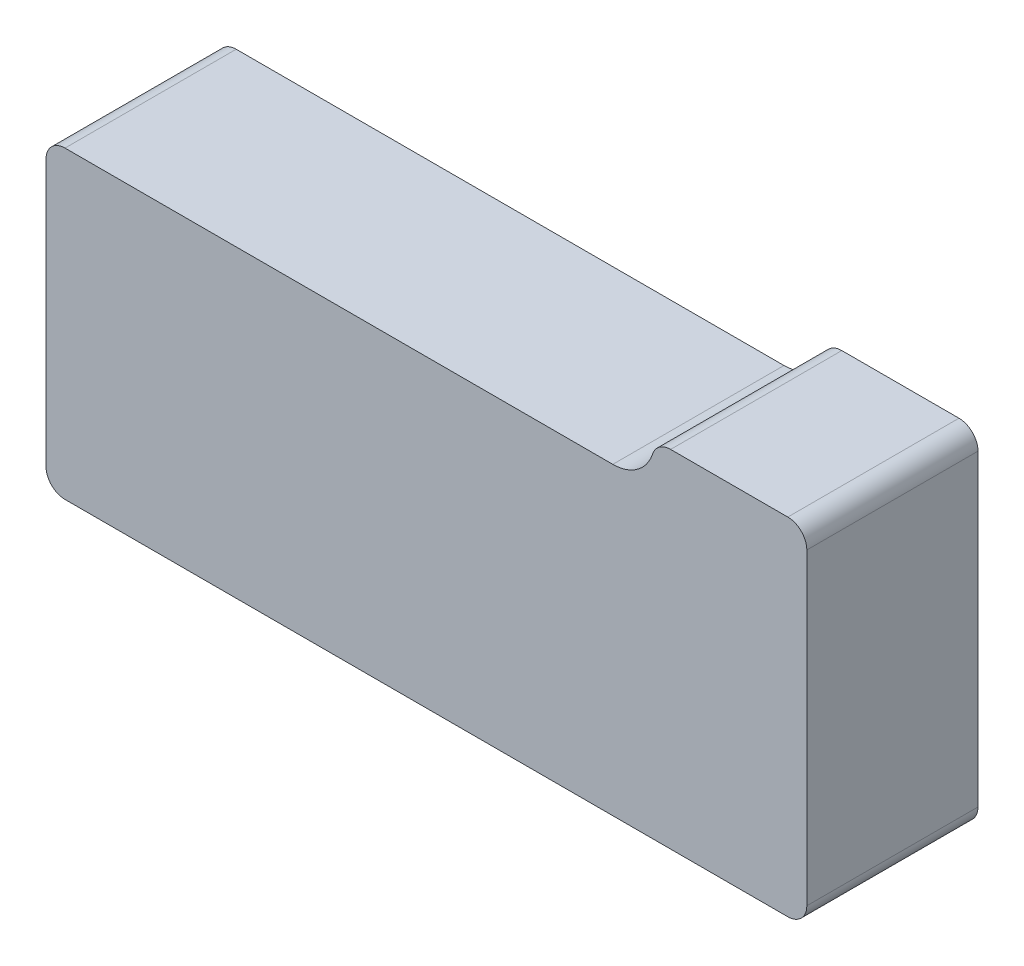
ISO-10303-21;
HEADER;
FILE_DESCRIPTION(('STEP AP214'),'2;1');
FILE_NAME('part.step','',(''),(''),'','','');
FILE_SCHEMA(('AUTOMOTIVE_DESIGN { 1 0 10303 214 1 1 1 1 }'));
ENDSEC;
DATA;
#1=APPLICATION_CONTEXT('core data for automotive mechanical design processes');
#2=APPLICATION_PROTOCOL_DEFINITION('international standard','automotive_design',2000,#1);
#3=PRODUCT_CONTEXT('',#1,'mechanical');
#4=PRODUCT('Part','Part','',(#3));
#5=PRODUCT_RELATED_PRODUCT_CATEGORY('part','',(#4));
#6=PRODUCT_DEFINITION_FORMATION('','',#4);
#7=PRODUCT_DEFINITION_CONTEXT('part definition',#1,'design');
#8=PRODUCT_DEFINITION('design','',#6,#7);
#9=PRODUCT_DEFINITION_SHAPE('','',#8);
#10=(LENGTH_UNIT() NAMED_UNIT(*) SI_UNIT(.MILLI.,.METRE.));
#11=(NAMED_UNIT(*) PLANE_ANGLE_UNIT() SI_UNIT($,.RADIAN.));
#12=(NAMED_UNIT(*) SI_UNIT($,.STERADIAN.) SOLID_ANGLE_UNIT());
#13=UNCERTAINTY_MEASURE_WITH_UNIT(LENGTH_MEASURE(1.E-05),#10,'distance_accuracy_value','');
#14=(GEOMETRIC_REPRESENTATION_CONTEXT(3) GLOBAL_UNCERTAINTY_ASSIGNED_CONTEXT((#13)) GLOBAL_UNIT_ASSIGNED_CONTEXT((#10,
#11,#12)) REPRESENTATION_CONTEXT('',''));
#15=CARTESIAN_POINT('',(0.,0.,0.));
#16=DIRECTION('',(0.,0.,1.));
#17=DIRECTION('',(1.,0.,0.));
#18=AXIS2_PLACEMENT_3D('',#15,#16,#17);
#19=CARTESIAN_POINT('',(49.,51.,45.));
#20=DIRECTION('',(0.,0.,-1.));
#21=DIRECTION('',(-1.,0.,0.));
#22=AXIS2_PLACEMENT_3D('',#19,#20,#21);
#23=CYLINDRICAL_SURFACE('',#22,11.);
#24=CARTESIAN_POINT('',(49.,51.,0.));
#25=DIRECTION('',(0.,0.,-1.));
#26=DIRECTION('',(1.,0.,0.));
#27=AXIS2_PLACEMENT_3D('',#24,#25,#26);
#28=CIRCLE('',#27,11.);
#29=CARTESIAN_POINT('',(59.4490953555798,47.5625,0.));
#30=VERTEX_POINT('',#29);
#31=CARTESIAN_POINT('',(49.,40.,0.));
#32=VERTEX_POINT('',#31);
#33=EDGE_CURVE('E152',#30,#32,#28,.T.);
#34=ORIENTED_EDGE('',*,*,#33,.T.);
#35=DIRECTION('',(0.,0.,-1.));
#36=VECTOR('',#35,1.);
#37=CARTESIAN_POINT('',(49.,40.,45.));
#38=LINE('',#37,#36);
#39=CARTESIAN_POINT('',(49.,40.,45.));
#40=VERTEX_POINT('',#39);
#41=EDGE_CURVE('E11',#40,#32,#38,.T.);
#42=ORIENTED_EDGE('',*,*,#41,.F.);
#43=CARTESIAN_POINT('',(49.,51.,45.));
#44=DIRECTION('',(0.,0.,-1.));
#45=DIRECTION('',(1.,0.,0.));
#46=AXIS2_PLACEMENT_3D('',#43,#44,#45);
#47=CIRCLE('',#46,11.);
#48=CARTESIAN_POINT('',(59.4490953555798,47.5625,45.));
#49=VERTEX_POINT('',#48);
#50=EDGE_CURVE('E176',#49,#40,#47,.T.);
#51=ORIENTED_EDGE('',*,*,#50,.F.);
#52=DIRECTION('',(0.,0.,-1.));
#53=VECTOR('',#52,1.);
#54=CARTESIAN_POINT('',(59.4490953555798,47.5625,45.));
#55=LINE('',#54,#53);
#56=EDGE_CURVE('E148',#49,#30,#55,.T.);
#57=ORIENTED_EDGE('',*,*,#56,.T.);
#58=EDGE_LOOP('',(#34,#42,#51,#57));
#59=FACE_BOUND('',#58,.T.);
#60=ADVANCED_FACE('F38',(#59),#23,.F.);
#61=CARTESIAN_POINT('',(-95.,40.,45.));
#62=DIRECTION('',(0.,-1.,0.));
#63=DIRECTION('',(1.,0.,0.));
#64=AXIS2_PLACEMENT_3D('',#61,#62,#63);
#65=PLANE('',#64);
#66=DIRECTION('',(-1.,0.,0.));
#67=VECTOR('',#66,1.);
#68=CARTESIAN_POINT('',(-95.,40.,0.));
#69=LINE('',#68,#67);
#70=CARTESIAN_POINT('',(-95.,40.,0.));
#71=VERTEX_POINT('',#70);
#72=EDGE_CURVE('E155',#32,#71,#69,.T.);
#73=ORIENTED_EDGE('',*,*,#72,.T.);
#74=DIRECTION('',(0.,0.,-1.));
#75=VECTOR('',#74,1.);
#76=CARTESIAN_POINT('',(-95.,40.,45.));
#77=LINE('',#76,#75);
#78=CARTESIAN_POINT('',(-95.,40.,45.));
#79=VERTEX_POINT('',#78);
#80=EDGE_CURVE('E46',#79,#71,#77,.T.);
#81=ORIENTED_EDGE('',*,*,#80,.F.);
#82=DIRECTION('',(-1.,0.,0.));
#83=VECTOR('',#82,1.);
#84=CARTESIAN_POINT('',(-95.,40.,45.));
#85=LINE('',#84,#83);
#86=EDGE_CURVE('E106',#40,#79,#85,.T.);
#87=ORIENTED_EDGE('',*,*,#86,.F.);
#88=ORIENTED_EDGE('',*,*,#41,.T.);
#89=EDGE_LOOP('',(#73,#81,#87,#88));
#90=FACE_BOUND('',#89,.T.);
#91=ADVANCED_FACE('F248',(#90),#65,.F.);
#92=CARTESIAN_POINT('',(-95.,35.,45.));
#93=DIRECTION('',(0.,0.,-1.));
#94=DIRECTION('',(-1.,0.,0.));
#95=AXIS2_PLACEMENT_3D('',#92,#93,#94);
#96=CYLINDRICAL_SURFACE('',#95,5.);
#97=CARTESIAN_POINT('',(-95.,35.,0.));
#98=DIRECTION('',(0.,0.,1.));
#99=DIRECTION('',(1.,0.,0.));
#100=AXIS2_PLACEMENT_3D('',#97,#98,#99);
#101=CIRCLE('',#100,5.);
#102=CARTESIAN_POINT('',(-100.,35.,0.));
#103=VERTEX_POINT('',#102);
#104=EDGE_CURVE('E158',#71,#103,#101,.T.);
#105=ORIENTED_EDGE('',*,*,#104,.T.);
#106=DIRECTION('',(0.,0.,-1.));
#107=VECTOR('',#106,1.);
#108=CARTESIAN_POINT('',(-100.,35.,45.));
#109=LINE('',#108,#107);
#110=CARTESIAN_POINT('',(-100.,35.,45.));
#111=VERTEX_POINT('',#110);
#112=EDGE_CURVE('E192',#111,#103,#109,.T.);
#113=ORIENTED_EDGE('',*,*,#112,.F.);
#114=CARTESIAN_POINT('',(-95.,35.,45.));
#115=DIRECTION('',(0.,0.,1.));
#116=DIRECTION('',(1.,0.,0.));
#117=AXIS2_PLACEMENT_3D('',#114,#115,#116);
#118=CIRCLE('',#117,5.);
#119=EDGE_CURVE('E200',#79,#111,#118,.T.);
#120=ORIENTED_EDGE('',*,*,#119,.F.);
#121=ORIENTED_EDGE('',*,*,#80,.T.);
#122=EDGE_LOOP('',(#105,#113,#120,#121));
#123=FACE_BOUND('',#122,.T.);
#124=ADVANCED_FACE('F198',(#123),#96,.T.);
#125=CARTESIAN_POINT('',(-100.,35.,45.));
#126=DIRECTION('',(1.,0.,0.));
#127=DIRECTION('',(0.,1.,0.));
#128=AXIS2_PLACEMENT_3D('',#125,#126,#127);
#129=PLANE('',#128);
#130=DIRECTION('',(0.,-1.,0.));
#131=VECTOR('',#130,1.);
#132=CARTESIAN_POINT('',(-100.,35.,0.));
#133=LINE('',#132,#131);
#134=CARTESIAN_POINT('',(-100.,-35.,0.));
#135=VERTEX_POINT('',#134);
#136=EDGE_CURVE('E160',#103,#135,#133,.T.);
#137=ORIENTED_EDGE('',*,*,#136,.T.);
#138=DIRECTION('',(0.,0.,-1.));
#139=VECTOR('',#138,1.);
#140=CARTESIAN_POINT('',(-100.,-35.,45.));
#141=LINE('',#140,#139);
#142=CARTESIAN_POINT('',(-100.,-35.,45.));
#143=VERTEX_POINT('',#142);
#144=EDGE_CURVE('E189',#143,#135,#141,.T.);
#145=ORIENTED_EDGE('',*,*,#144,.F.);
#146=DIRECTION('',(0.,-1.,0.));
#147=VECTOR('',#146,1.);
#148=CARTESIAN_POINT('',(-100.,35.,45.));
#149=LINE('',#148,#147);
#150=EDGE_CURVE('E218',#111,#143,#149,.T.);
#151=ORIENTED_EDGE('',*,*,#150,.F.);
#152=ORIENTED_EDGE('',*,*,#112,.T.);
#153=EDGE_LOOP('',(#137,#145,#151,#152));
#154=FACE_BOUND('',#153,.T.);
#155=ADVANCED_FACE('F209',(#154),#129,.F.);
#156=CARTESIAN_POINT('',(-95.,-35.,45.));
#157=DIRECTION('',(0.,0.,-1.));
#158=DIRECTION('',(-1.,0.,0.));
#159=AXIS2_PLACEMENT_3D('',#156,#157,#158);
#160=CYLINDRICAL_SURFACE('',#159,5.);
#161=CARTESIAN_POINT('',(-95.,-35.,0.));
#162=DIRECTION('',(0.,0.,1.));
#163=DIRECTION('',(1.,0.,0.));
#164=AXIS2_PLACEMENT_3D('',#161,#162,#163);
#165=CIRCLE('',#164,5.);
#166=CARTESIAN_POINT('',(-95.,-40.,0.));
#167=VERTEX_POINT('',#166);
#168=EDGE_CURVE('E163',#135,#167,#165,.T.);
#169=ORIENTED_EDGE('',*,*,#168,.T.);
#170=DIRECTION('',(0.,0.,-1.));
#171=VECTOR('',#170,1.);
#172=CARTESIAN_POINT('',(-95.,-40.,45.));
#173=LINE('',#172,#171);
#174=CARTESIAN_POINT('',(-95.,-40.,45.));
#175=VERTEX_POINT('',#174);
#176=EDGE_CURVE('E186',#175,#167,#173,.T.);
#177=ORIENTED_EDGE('',*,*,#176,.F.);
#178=CARTESIAN_POINT('',(-95.,-35.,45.));
#179=DIRECTION('',(0.,0.,1.));
#180=DIRECTION('',(1.,0.,0.));
#181=AXIS2_PLACEMENT_3D('',#178,#179,#180);
#182=CIRCLE('',#181,5.);
#183=EDGE_CURVE('E215',#143,#175,#182,.T.);
#184=ORIENTED_EDGE('',*,*,#183,.F.);
#185=ORIENTED_EDGE('',*,*,#144,.T.);
#186=EDGE_LOOP('',(#169,#177,#184,#185));
#187=FACE_BOUND('',#186,.T.);
#188=ADVANCED_FACE('F213',(#187),#160,.T.);
#189=CARTESIAN_POINT('',(-95.,-40.,45.));
#190=DIRECTION('',(0.,1.,0.));
#191=DIRECTION('',(0.,0.,1.));
#192=AXIS2_PLACEMENT_3D('',#189,#190,#191);
#193=PLANE('',#192);
#194=DIRECTION('',(1.,0.,0.));
#195=VECTOR('',#194,1.);
#196=CARTESIAN_POINT('',(-95.,-40.,0.));
#197=LINE('',#196,#195);
#198=CARTESIAN_POINT('',(95.,-40.,0.));
#199=VERTEX_POINT('',#198);
#200=EDGE_CURVE('E165',#167,#199,#197,.T.);
#201=ORIENTED_EDGE('',*,*,#200,.T.);
#202=DIRECTION('',(0.,0.,-1.));
#203=VECTOR('',#202,1.);
#204=CARTESIAN_POINT('',(95.,-40.,45.));
#205=LINE('',#204,#203);
#206=CARTESIAN_POINT('',(95.,-40.,45.));
#207=VERTEX_POINT('',#206);
#208=EDGE_CURVE('E183',#207,#199,#205,.T.);
#209=ORIENTED_EDGE('',*,*,#208,.F.);
#210=DIRECTION('',(1.,0.,0.));
#211=VECTOR('',#210,1.);
#212=CARTESIAN_POINT('',(-95.,-40.,45.));
#213=LINE('',#212,#211);
#214=EDGE_CURVE('E217',#175,#207,#213,.T.);
#215=ORIENTED_EDGE('',*,*,#214,.F.);
#216=ORIENTED_EDGE('',*,*,#176,.T.);
#217=EDGE_LOOP('',(#201,#209,#215,#216));
#218=FACE_BOUND('',#217,.T.);
#219=ADVANCED_FACE('F261',(#218),#193,.F.);
#220=CARTESIAN_POINT('',(95.,-35.,45.));
#221=DIRECTION('',(0.,0.,-1.));
#222=DIRECTION('',(-1.,0.,0.));
#223=AXIS2_PLACEMENT_3D('',#220,#221,#222);
#224=CYLINDRICAL_SURFACE('',#223,5.);
#225=CARTESIAN_POINT('',(95.,-35.,0.));
#226=DIRECTION('',(0.,0.,1.));
#227=DIRECTION('',(1.,0.,0.));
#228=AXIS2_PLACEMENT_3D('',#225,#226,#227);
#229=CIRCLE('',#228,5.);
#230=CARTESIAN_POINT('',(100.,-35.,0.));
#231=VERTEX_POINT('',#230);
#232=EDGE_CURVE('E168',#199,#231,#229,.T.);
#233=ORIENTED_EDGE('',*,*,#232,.T.);
#234=DIRECTION('',(0.,0.,-1.));
#235=VECTOR('',#234,1.);
#236=CARTESIAN_POINT('',(100.,-35.,45.));
#237=LINE('',#236,#235);
#238=CARTESIAN_POINT('',(100.,-35.,45.));
#239=VERTEX_POINT('',#238);
#240=EDGE_CURVE('E180',#239,#231,#237,.T.);
#241=ORIENTED_EDGE('',*,*,#240,.F.);
#242=CARTESIAN_POINT('',(95.,-35.,45.));
#243=DIRECTION('',(0.,0.,1.));
#244=DIRECTION('',(1.,0.,0.));
#245=AXIS2_PLACEMENT_3D('',#242,#243,#244);
#246=CIRCLE('',#245,5.);
#247=EDGE_CURVE('E220',#207,#239,#246,.T.);
#248=ORIENTED_EDGE('',*,*,#247,.F.);
#249=ORIENTED_EDGE('',*,*,#208,.T.);
#250=EDGE_LOOP('',(#233,#241,#248,#249));
#251=FACE_BOUND('',#250,.T.);
#252=ADVANCED_FACE('F229',(#251),#224,.T.);
#253=CARTESIAN_POINT('',(100.,46.,45.));
#254=DIRECTION('',(-1.,0.,0.));
#255=DIRECTION('',(0.,-1.,0.));
#256=AXIS2_PLACEMENT_3D('',#253,#254,#255);
#257=PLANE('',#256);
#258=DIRECTION('',(0.,1.,0.));
#259=VECTOR('',#258,1.);
#260=CARTESIAN_POINT('',(100.,46.,0.));
#261=LINE('',#260,#259);
#262=CARTESIAN_POINT('',(100.,46.,0.));
#263=VERTEX_POINT('',#262);
#264=EDGE_CURVE('E170',#231,#263,#261,.T.);
#265=ORIENTED_EDGE('',*,*,#264,.T.);
#266=DIRECTION('',(0.,0.,-1.));
#267=VECTOR('',#266,1.);
#268=CARTESIAN_POINT('',(100.,46.,45.));
#269=LINE('',#268,#267);
#270=CARTESIAN_POINT('',(100.,46.,45.));
#271=VERTEX_POINT('',#270);
#272=EDGE_CURVE('E143',#271,#263,#269,.T.);
#273=ORIENTED_EDGE('',*,*,#272,.F.);
#274=DIRECTION('',(0.,1.,0.));
#275=VECTOR('',#274,1.);
#276=CARTESIAN_POINT('',(100.,46.,45.));
#277=LINE('',#276,#275);
#278=EDGE_CURVE('E134',#239,#271,#277,.T.);
#279=ORIENTED_EDGE('',*,*,#278,.F.);
#280=ORIENTED_EDGE('',*,*,#240,.T.);
#281=EDGE_LOOP('',(#265,#273,#279,#280));
#282=FACE_BOUND('',#281,.T.);
#283=ADVANCED_FACE('F233',(#282),#257,.F.);
#284=CARTESIAN_POINT('',(95.,46.,45.));
#285=DIRECTION('',(0.,0.,-1.));
#286=DIRECTION('',(-1.,0.,0.));
#287=AXIS2_PLACEMENT_3D('',#284,#285,#286);
#288=CYLINDRICAL_SURFACE('',#287,5.);
#289=CARTESIAN_POINT('',(95.,46.,0.));
#290=DIRECTION('',(0.,0.,1.));
#291=DIRECTION('',(1.,0.,0.));
#292=AXIS2_PLACEMENT_3D('',#289,#290,#291);
#293=CIRCLE('',#292,5.);
#294=CARTESIAN_POINT('',(95.,51.,0.));
#295=VERTEX_POINT('',#294);
#296=EDGE_CURVE('E142',#263,#295,#293,.T.);
#297=ORIENTED_EDGE('',*,*,#296,.T.);
#298=DIRECTION('',(0.,0.,-1.));
#299=VECTOR('',#298,1.);
#300=CARTESIAN_POINT('',(95.,51.,45.));
#301=LINE('',#300,#299);
#302=CARTESIAN_POINT('',(95.,51.,45.));
#303=VERTEX_POINT('',#302);
#304=EDGE_CURVE('E139',#303,#295,#301,.T.);
#305=ORIENTED_EDGE('',*,*,#304,.F.);
#306=CARTESIAN_POINT('',(95.,46.,45.));
#307=DIRECTION('',(0.,0.,1.));
#308=DIRECTION('',(1.,0.,0.));
#309=AXIS2_PLACEMENT_3D('',#306,#307,#308);
#310=CIRCLE('',#309,5.);
#311=EDGE_CURVE('E128',#271,#303,#310,.T.);
#312=ORIENTED_EDGE('',*,*,#311,.F.);
#313=ORIENTED_EDGE('',*,*,#272,.T.);
#314=EDGE_LOOP('',(#297,#305,#312,#313));
#315=FACE_BOUND('',#314,.T.);
#316=ADVANCED_FACE('F140',(#315),#288,.T.);
#317=CARTESIAN_POINT('',(95.,51.,45.));
#318=DIRECTION('',(0.,-1.,0.));
#319=DIRECTION('',(0.,0.,-1.));
#320=AXIS2_PLACEMENT_3D('',#317,#318,#319);
#321=PLANE('',#320);
#322=DIRECTION('',(-1.,0.,0.));
#323=VECTOR('',#322,1.);
#324=CARTESIAN_POINT('',(95.,51.,0.));
#325=LINE('',#324,#323);
#326=CARTESIAN_POINT('',(64.1986841535707,51.,0.));
#327=VERTEX_POINT('',#326);
#328=EDGE_CURVE('E92',#295,#327,#325,.T.);
#329=ORIENTED_EDGE('',*,*,#328,.T.);
#330=DIRECTION('',(0.,0.,-1.));
#331=VECTOR('',#330,1.);
#332=CARTESIAN_POINT('',(64.1986841535707,51.,45.));
#333=LINE('',#332,#331);
#334=CARTESIAN_POINT('',(64.1986841535707,51.,45.));
#335=VERTEX_POINT('',#334);
#336=EDGE_CURVE('E144',#335,#327,#333,.T.);
#337=ORIENTED_EDGE('',*,*,#336,.F.);
#338=DIRECTION('',(-1.,0.,0.));
#339=VECTOR('',#338,1.);
#340=CARTESIAN_POINT('',(95.,51.,45.));
#341=LINE('',#340,#339);
#342=EDGE_CURVE('E132',#303,#335,#341,.T.);
#343=ORIENTED_EDGE('',*,*,#342,.F.);
#344=ORIENTED_EDGE('',*,*,#304,.T.);
#345=EDGE_LOOP('',(#329,#337,#343,#344));
#346=FACE_BOUND('',#345,.T.);
#347=ADVANCED_FACE('F146',(#346),#321,.F.);
#348=CARTESIAN_POINT('',(64.1986841535707,46.,45.));
#349=DIRECTION('',(0.,0.,-1.));
#350=DIRECTION('',(-1.,0.,0.));
#351=AXIS2_PLACEMENT_3D('',#348,#349,#350);
#352=CYLINDRICAL_SURFACE('',#351,5.);
#353=CARTESIAN_POINT('',(64.1986841535707,46.,0.));
#354=DIRECTION('',(0.,0.,1.));
#355=DIRECTION('',(-1.,0.,0.));
#356=AXIS2_PLACEMENT_3D('',#353,#354,#355);
#357=CIRCLE('',#356,5.);
#358=EDGE_CURVE('E98',#327,#30,#357,.T.);
#359=ORIENTED_EDGE('',*,*,#358,.T.);
#360=ORIENTED_EDGE('',*,*,#56,.F.);
#361=CARTESIAN_POINT('',(64.1986841535707,46.,45.));
#362=DIRECTION('',(0.,0.,1.));
#363=DIRECTION('',(-1.,0.,0.));
#364=AXIS2_PLACEMENT_3D('',#361,#362,#363);
#365=CIRCLE('',#364,5.);
#366=EDGE_CURVE('E54',#335,#49,#365,.T.);
#367=ORIENTED_EDGE('',*,*,#366,.F.);
#368=ORIENTED_EDGE('',*,*,#336,.T.);
#369=EDGE_LOOP('',(#359,#360,#367,#368));
#370=FACE_BOUND('',#369,.T.);
#371=ADVANCED_FACE('F237',(#370),#352,.T.);
#372=CARTESIAN_POINT('',(49.,51.,45.));
#373=DIRECTION('',(0.,0.,1.));
#374=DIRECTION('',(1.,0.,0.));
#375=AXIS2_PLACEMENT_3D('',#372,#373,#374);
#376=PLANE('',#375);
#377=ORIENTED_EDGE('',*,*,#50,.T.);
#378=ORIENTED_EDGE('',*,*,#86,.T.);
#379=ORIENTED_EDGE('',*,*,#119,.T.);
#380=ORIENTED_EDGE('',*,*,#150,.T.);
#381=ORIENTED_EDGE('',*,*,#183,.T.);
#382=ORIENTED_EDGE('',*,*,#214,.T.);
#383=ORIENTED_EDGE('',*,*,#247,.T.);
#384=ORIENTED_EDGE('',*,*,#278,.T.);
#385=ORIENTED_EDGE('',*,*,#311,.T.);
#386=ORIENTED_EDGE('',*,*,#342,.T.);
#387=ORIENTED_EDGE('',*,*,#366,.T.);
#388=EDGE_LOOP('',(#377,#378,#379,#380,#381,#382,#383,#384,#385,#386,#387));
#389=FACE_BOUND('',#388,.T.);
#390=ADVANCED_FACE('F130',(#389),#376,.T.);
#391=CARTESIAN_POINT('',(49.,51.,0.));
#392=DIRECTION('',(0.,0.,1.));
#393=DIRECTION('',(1.,0.,0.));
#394=AXIS2_PLACEMENT_3D('',#391,#392,#393);
#395=PLANE('',#394);
#396=ORIENTED_EDGE('',*,*,#33,.F.);
#397=ORIENTED_EDGE('',*,*,#358,.F.);
#398=ORIENTED_EDGE('',*,*,#328,.F.);
#399=ORIENTED_EDGE('',*,*,#296,.F.);
#400=ORIENTED_EDGE('',*,*,#264,.F.);
#401=ORIENTED_EDGE('',*,*,#232,.F.);
#402=ORIENTED_EDGE('',*,*,#200,.F.);
#403=ORIENTED_EDGE('',*,*,#168,.F.);
#404=ORIENTED_EDGE('',*,*,#136,.F.);
#405=ORIENTED_EDGE('',*,*,#104,.F.);
#406=ORIENTED_EDGE('',*,*,#72,.F.);
#407=EDGE_LOOP('',(#396,#397,#398,#399,#400,#401,#402,#403,#404,#405,#406));
#408=FACE_BOUND('',#407,.T.);
#409=ADVANCED_FACE('F204',(#408),#395,.F.);
#410=CLOSED_SHELL('',(#60,#91,#124,#155,#188,#219,#252,#283,#316,#347,#371,#390,#409));
#411=MANIFOLD_SOLID_BREP('B2',#410);
#412=ADVANCED_BREP_SHAPE_REPRESENTATION('',(#18,#411),#14);
#413=SHAPE_DEFINITION_REPRESENTATION(#9,#412);
ENDSEC;
END-ISO-10303-21;
